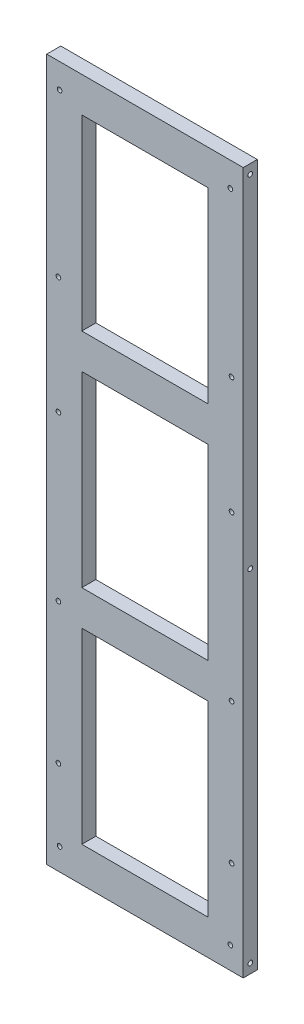
ISO-10303-21;
HEADER;
FILE_DESCRIPTION(('STEP AP214'),'2;1');
FILE_NAME('part.step','',(''),(''),'','','');
FILE_SCHEMA(('AUTOMOTIVE_DESIGN { 1 0 10303 214 1 1 1 1 }'));
ENDSEC;
DATA;
#1=APPLICATION_CONTEXT('core data for automotive mechanical design processes');
#2=APPLICATION_PROTOCOL_DEFINITION('international standard','automotive_design',2000,#1);
#3=PRODUCT_CONTEXT('',#1,'mechanical');
#4=PRODUCT('Part','Part','',(#3));
#5=PRODUCT_RELATED_PRODUCT_CATEGORY('part','',(#4));
#6=PRODUCT_DEFINITION_FORMATION('','',#4);
#7=PRODUCT_DEFINITION_CONTEXT('part definition',#1,'design');
#8=PRODUCT_DEFINITION('design','',#6,#7);
#9=PRODUCT_DEFINITION_SHAPE('','',#8);
#10=(LENGTH_UNIT() NAMED_UNIT(*) SI_UNIT(.MILLI.,.METRE.));
#11=(NAMED_UNIT(*) PLANE_ANGLE_UNIT() SI_UNIT($,.RADIAN.));
#12=(NAMED_UNIT(*) SI_UNIT($,.STERADIAN.) SOLID_ANGLE_UNIT());
#13=UNCERTAINTY_MEASURE_WITH_UNIT(LENGTH_MEASURE(1.E-05),#10,'distance_accuracy_value','');
#14=(GEOMETRIC_REPRESENTATION_CONTEXT(3) GLOBAL_UNCERTAINTY_ASSIGNED_CONTEXT((#13)) GLOBAL_UNIT_ASSIGNED_CONTEXT((#10,
#11,#12)) REPRESENTATION_CONTEXT('',''));
#15=CARTESIAN_POINT('',(0.,0.,0.));
#16=DIRECTION('',(0.,0.,1.));
#17=DIRECTION('',(1.,0.,0.));
#18=AXIS2_PLACEMENT_3D('',#15,#16,#17);
#19=CARTESIAN_POINT('',(0.,0.,6.));
#20=DIRECTION('',(0.,0.,-1.));
#21=DIRECTION('',(-1.,0.,0.));
#22=AXIS2_PLACEMENT_3D('',#19,#20,#21);
#23=PLANE('',#22);
#24=CARTESIAN_POINT('',(36.5,-140.5,6.));
#25=DIRECTION('',(0.,0.,1.));
#26=DIRECTION('',(1.,0.,0.));
#27=AXIS2_PLACEMENT_3D('',#24,#25,#26);
#28=CIRCLE('',#27,0.999999999999998);
#29=CARTESIAN_POINT('',(37.5,-140.5,6.));
#30=VERTEX_POINT('',#29);
#31=EDGE_CURVE('E563',#30,#30,#28,.T.);
#32=ORIENTED_EDGE('',*,*,#31,.F.);
#33=EDGE_LOOP('',(#32));
#34=FACE_BOUND('',#33,.T.);
#35=CARTESIAN_POINT('',(-36.5,139.5,6.));
#36=DIRECTION('',(0.,0.,1.));
#37=DIRECTION('',(1.,0.,0.));
#38=AXIS2_PLACEMENT_3D('',#35,#36,#37);
#39=CIRCLE('',#38,0.999999999999998);
#40=CARTESIAN_POINT('',(-35.5,139.5,6.));
#41=VERTEX_POINT('',#40);
#42=EDGE_CURVE('E560',#41,#41,#39,.T.);
#43=ORIENTED_EDGE('',*,*,#42,.F.);
#44=EDGE_LOOP('',(#43));
#45=FACE_BOUND('',#44,.T.);
#46=CARTESIAN_POINT('',(36.5,139.5,6.));
#47=DIRECTION('',(0.,0.,1.));
#48=DIRECTION('',(1.,0.,0.));
#49=AXIS2_PLACEMENT_3D('',#46,#47,#48);
#50=CIRCLE('',#49,0.999999999999998);
#51=CARTESIAN_POINT('',(37.5,139.5,6.));
#52=VERTEX_POINT('',#51);
#53=EDGE_CURVE('E558',#52,#52,#50,.T.);
#54=ORIENTED_EDGE('',*,*,#53,.F.);
#55=EDGE_LOOP('',(#54));
#56=FACE_BOUND('',#55,.T.);
#57=CARTESIAN_POINT('',(-36.5,-140.5,6.));
#58=DIRECTION('',(0.,0.,1.));
#59=DIRECTION('',(1.,0.,0.));
#60=AXIS2_PLACEMENT_3D('',#57,#58,#59);
#61=CIRCLE('',#60,0.999999999999998);
#62=CARTESIAN_POINT('',(-35.5,-140.5,6.));
#63=VERTEX_POINT('',#62);
#64=EDGE_CURVE('E303',#63,#63,#61,.T.);
#65=ORIENTED_EDGE('',*,*,#64,.F.);
#66=EDGE_LOOP('',(#65));
#67=FACE_BOUND('',#66,.T.);
#68=CARTESIAN_POINT('',(37.,-110.,6.));
#69=DIRECTION('',(0.,0.,1.));
#70=DIRECTION('',(-1.,0.,0.));
#71=AXIS2_PLACEMENT_3D('',#68,#69,#70);
#72=CIRCLE('',#71,0.999999999999998);
#73=CARTESIAN_POINT('',(36.,-110.,6.));
#74=VERTEX_POINT('',#73);
#75=EDGE_CURVE('E323',#74,#74,#72,.T.);
#76=ORIENTED_EDGE('',*,*,#75,.F.);
#77=EDGE_LOOP('',(#76));
#78=FACE_BOUND('',#77,.T.);
#79=CARTESIAN_POINT('',(37.,-50.,6.));
#80=DIRECTION('',(0.,0.,1.));
#81=DIRECTION('',(-1.,0.,0.));
#82=AXIS2_PLACEMENT_3D('',#79,#80,#81);
#83=CIRCLE('',#82,0.999999999999998);
#84=CARTESIAN_POINT('',(36.,-50.,6.));
#85=VERTEX_POINT('',#84);
#86=EDGE_CURVE('E326',#85,#85,#83,.T.);
#87=ORIENTED_EDGE('',*,*,#86,.F.);
#88=EDGE_LOOP('',(#87));
#89=FACE_BOUND('',#88,.T.);
#90=CARTESIAN_POINT('',(-37.,20.,6.));
#91=DIRECTION('',(0.,0.,1.));
#92=DIRECTION('',(1.,0.,0.));
#93=AXIS2_PLACEMENT_3D('',#90,#91,#92);
#94=CIRCLE('',#93,0.999999999999998);
#95=CARTESIAN_POINT('',(-36.,20.,6.));
#96=VERTEX_POINT('',#95);
#97=EDGE_CURVE('E329',#96,#96,#94,.T.);
#98=ORIENTED_EDGE('',*,*,#97,.F.);
#99=EDGE_LOOP('',(#98));
#100=FACE_BOUND('',#99,.T.);
#101=CARTESIAN_POINT('',(37.,20.,6.));
#102=DIRECTION('',(0.,0.,1.));
#103=DIRECTION('',(-1.,0.,0.));
#104=AXIS2_PLACEMENT_3D('',#101,#102,#103);
#105=CIRCLE('',#104,0.999999999999998);
#106=CARTESIAN_POINT('',(36.,20.,6.));
#107=VERTEX_POINT('',#106);
#108=EDGE_CURVE('E332',#107,#107,#105,.T.);
#109=ORIENTED_EDGE('',*,*,#108,.F.);
#110=EDGE_LOOP('',(#109));
#111=FACE_BOUND('',#110,.T.);
#112=CARTESIAN_POINT('',(37.,70.,6.));
#113=DIRECTION('',(0.,0.,1.));
#114=DIRECTION('',(-1.,0.,0.));
#115=AXIS2_PLACEMENT_3D('',#112,#113,#114);
#116=CIRCLE('',#115,0.999999999999998);
#117=CARTESIAN_POINT('',(36.,70.,6.));
#118=VERTEX_POINT('',#117);
#119=EDGE_CURVE('E319',#118,#118,#116,.T.);
#120=ORIENTED_EDGE('',*,*,#119,.F.);
#121=EDGE_LOOP('',(#120));
#122=FACE_BOUND('',#121,.T.);
#123=CARTESIAN_POINT('',(-37.,70.,6.));
#124=DIRECTION('',(0.,0.,1.));
#125=DIRECTION('',(1.,0.,0.));
#126=AXIS2_PLACEMENT_3D('',#123,#124,#125);
#127=CIRCLE('',#126,0.999999999999998);
#128=CARTESIAN_POINT('',(-36.,70.,6.));
#129=VERTEX_POINT('',#128);
#130=EDGE_CURVE('E314',#129,#129,#127,.T.);
#131=ORIENTED_EDGE('',*,*,#130,.F.);
#132=EDGE_LOOP('',(#131));
#133=FACE_BOUND('',#132,.T.);
#134=CARTESIAN_POINT('',(-37.,-50.,6.));
#135=DIRECTION('',(0.,0.,1.));
#136=DIRECTION('',(1.,0.,0.));
#137=AXIS2_PLACEMENT_3D('',#134,#135,#136);
#138=CIRCLE('',#137,0.999999999999998);
#139=CARTESIAN_POINT('',(-36.,-50.,6.));
#140=VERTEX_POINT('',#139);
#141=EDGE_CURVE('E310',#140,#140,#138,.T.);
#142=ORIENTED_EDGE('',*,*,#141,.F.);
#143=EDGE_LOOP('',(#142));
#144=FACE_BOUND('',#143,.T.);
#145=CARTESIAN_POINT('',(-37.,-110.,6.));
#146=DIRECTION('',(0.,0.,1.));
#147=DIRECTION('',(1.,0.,0.));
#148=AXIS2_PLACEMENT_3D('',#145,#146,#147);
#149=CIRCLE('',#148,0.999999999999998);
#150=CARTESIAN_POINT('',(-36.,-110.,6.));
#151=VERTEX_POINT('',#150);
#152=EDGE_CURVE('E277',#151,#151,#149,.T.);
#153=ORIENTED_EDGE('',*,*,#152,.F.);
#154=EDGE_LOOP('',(#153));
#155=FACE_BOUND('',#154,.T.);
#156=DIRECTION('',(0.,-1.,0.));
#157=VECTOR('',#156,1.);
#158=CARTESIAN_POINT('',(-27.,-135.,6.));
#159=LINE('',#158,#157);
#160=CARTESIAN_POINT('',(-27.,-55.,6.));
#161=VERTEX_POINT('',#160);
#162=CARTESIAN_POINT('',(-27.,-135.,6.));
#163=VERTEX_POINT('',#162);
#164=EDGE_CURVE('E186',#161,#163,#159,.T.);
#165=ORIENTED_EDGE('',*,*,#164,.F.);
#166=DIRECTION('',(-1.,0.,0.));
#167=VECTOR('',#166,1.);
#168=CARTESIAN_POINT('',(-27.,-55.,6.));
#169=LINE('',#168,#167);
#170=CARTESIAN_POINT('',(27.,-55.,6.));
#171=VERTEX_POINT('',#170);
#172=EDGE_CURVE('E194',#171,#161,#169,.T.);
#173=ORIENTED_EDGE('',*,*,#172,.F.);
#174=DIRECTION('',(0.,1.,0.));
#175=VECTOR('',#174,1.);
#176=CARTESIAN_POINT('',(27.,-55.,6.));
#177=LINE('',#176,#175);
#178=CARTESIAN_POINT('',(27.,-135.,6.));
#179=VERTEX_POINT('',#178);
#180=EDGE_CURVE('E191',#179,#171,#177,.T.);
#181=ORIENTED_EDGE('',*,*,#180,.F.);
#182=DIRECTION('',(1.,0.,0.));
#183=VECTOR('',#182,1.);
#184=CARTESIAN_POINT('',(-27.,-135.,6.));
#185=LINE('',#184,#183);
#186=EDGE_CURVE('E188',#163,#179,#185,.T.);
#187=ORIENTED_EDGE('',*,*,#186,.F.);
#188=EDGE_LOOP('',(#165,#173,#181,#187));
#189=FACE_BOUND('',#188,.T.);
#190=DIRECTION('',(0.,1.,0.));
#191=VECTOR('',#190,1.);
#192=CARTESIAN_POINT('',(42.,-150.,6.));
#193=LINE('',#192,#191);
#194=CARTESIAN_POINT('',(42.,-150.,6.));
#195=VERTEX_POINT('',#194);
#196=CARTESIAN_POINT('',(42.,150.,6.));
#197=VERTEX_POINT('',#196);
#198=EDGE_CURVE('E248',#195,#197,#193,.T.);
#199=ORIENTED_EDGE('',*,*,#198,.T.);
#200=DIRECTION('',(-1.,0.,0.));
#201=VECTOR('',#200,1.);
#202=CARTESIAN_POINT('',(-42.,150.,6.));
#203=LINE('',#202,#201);
#204=CARTESIAN_POINT('',(-42.,150.,6.));
#205=VERTEX_POINT('',#204);
#206=EDGE_CURVE('E251',#197,#205,#203,.T.);
#207=ORIENTED_EDGE('',*,*,#206,.T.);
#208=DIRECTION('',(0.,-1.,0.));
#209=VECTOR('',#208,1.);
#210=CARTESIAN_POINT('',(-42.,-150.,6.));
#211=LINE('',#210,#209);
#212=CARTESIAN_POINT('',(-42.,-150.,6.));
#213=VERTEX_POINT('',#212);
#214=EDGE_CURVE('E254',#205,#213,#211,.T.);
#215=ORIENTED_EDGE('',*,*,#214,.T.);
#216=DIRECTION('',(1.,0.,0.));
#217=VECTOR('',#216,1.);
#218=CARTESIAN_POINT('',(-42.,-150.,6.));
#219=LINE('',#218,#217);
#220=EDGE_CURVE('E256',#213,#195,#219,.T.);
#221=ORIENTED_EDGE('',*,*,#220,.T.);
#222=EDGE_LOOP('',(#199,#207,#215,#221));
#223=FACE_BOUND('',#222,.T.);
#224=DIRECTION('',(-1.,0.,0.));
#225=VECTOR('',#224,1.);
#226=CARTESIAN_POINT('',(-27.,135.,6.));
#227=LINE('',#226,#225);
#228=CARTESIAN_POINT('',(27.,135.,6.));
#229=VERTEX_POINT('',#228);
#230=CARTESIAN_POINT('',(-27.,135.,6.));
#231=VERTEX_POINT('',#230);
#232=EDGE_CURVE('E217',#229,#231,#227,.T.);
#233=ORIENTED_EDGE('',*,*,#232,.F.);
#234=DIRECTION('',(0.,1.,0.));
#235=VECTOR('',#234,1.);
#236=CARTESIAN_POINT('',(27.,135.,6.));
#237=LINE('',#236,#235);
#238=CARTESIAN_POINT('',(27.,55.,6.));
#239=VERTEX_POINT('',#238);
#240=EDGE_CURVE('E225',#239,#229,#237,.T.);
#241=ORIENTED_EDGE('',*,*,#240,.F.);
#242=DIRECTION('',(1.,0.,0.));
#243=VECTOR('',#242,1.);
#244=CARTESIAN_POINT('',(-27.,55.,6.));
#245=LINE('',#244,#243);
#246=CARTESIAN_POINT('',(-27.,55.,6.));
#247=VERTEX_POINT('',#246);
#248=EDGE_CURVE('E222',#247,#239,#245,.T.);
#249=ORIENTED_EDGE('',*,*,#248,.F.);
#250=DIRECTION('',(0.,-1.,0.));
#251=VECTOR('',#250,1.);
#252=CARTESIAN_POINT('',(-27.,55.,6.));
#253=LINE('',#252,#251);
#254=EDGE_CURVE('E219',#231,#247,#253,.T.);
#255=ORIENTED_EDGE('',*,*,#254,.F.);
#256=EDGE_LOOP('',(#233,#241,#249,#255));
#257=FACE_BOUND('',#256,.T.);
#258=DIRECTION('',(0.,1.,0.));
#259=VECTOR('',#258,1.);
#260=CARTESIAN_POINT('',(27.,40.,6.));
#261=LINE('',#260,#259);
#262=CARTESIAN_POINT('',(27.,-40.,6.));
#263=VERTEX_POINT('',#262);
#264=CARTESIAN_POINT('',(27.,40.,6.));
#265=VERTEX_POINT('',#264);
#266=EDGE_CURVE('E148',#263,#265,#261,.T.);
#267=ORIENTED_EDGE('',*,*,#266,.F.);
#268=DIRECTION('',(1.,0.,0.));
#269=VECTOR('',#268,1.);
#270=CARTESIAN_POINT('',(-27.,-40.,6.));
#271=LINE('',#270,#269);
#272=CARTESIAN_POINT('',(-27.,-40.,6.));
#273=VERTEX_POINT('',#272);
#274=EDGE_CURVE('E170',#273,#263,#271,.T.);
#275=ORIENTED_EDGE('',*,*,#274,.F.);
#276=DIRECTION('',(0.,-1.,0.));
#277=VECTOR('',#276,1.);
#278=CARTESIAN_POINT('',(-27.,-40.,6.));
#279=LINE('',#278,#277);
#280=CARTESIAN_POINT('',(-27.,40.,6.));
#281=VERTEX_POINT('',#280);
#282=EDGE_CURVE('E168',#281,#273,#279,.T.);
#283=ORIENTED_EDGE('',*,*,#282,.F.);
#284=DIRECTION('',(-1.,0.,0.));
#285=VECTOR('',#284,1.);
#286=CARTESIAN_POINT('',(-27.,40.,6.));
#287=LINE('',#286,#285);
#288=EDGE_CURVE('E156',#265,#281,#287,.T.);
#289=ORIENTED_EDGE('',*,*,#288,.F.);
#290=EDGE_LOOP('',(#267,#275,#283,#289));
#291=FACE_BOUND('',#290,.T.);
#292=ADVANCED_FACE('F33',(#34,#45,#56,#67,#78,#89,#100,#111,#122,#133,#144,#155,#189,#223,#257,
#291),#23,.F.);
#293=CARTESIAN_POINT('',(0.,0.,0.));
#294=DIRECTION('',(0.,0.,-1.));
#295=DIRECTION('',(-1.,0.,0.));
#296=AXIS2_PLACEMENT_3D('',#293,#294,#295);
#297=PLANE('',#296);
#298=CARTESIAN_POINT('',(36.5,-140.5,0.));
#299=DIRECTION('',(0.,0.,-1.));
#300=DIRECTION('',(-1.,0.,0.));
#301=AXIS2_PLACEMENT_3D('',#298,#299,#300);
#302=CIRCLE('',#301,0.999999999999998);
#303=CARTESIAN_POINT('',(35.5,-140.5,0.));
#304=VERTEX_POINT('',#303);
#305=EDGE_CURVE('E37',#304,#304,#302,.T.);
#306=ORIENTED_EDGE('',*,*,#305,.F.);
#307=EDGE_LOOP('',(#306));
#308=FACE_BOUND('',#307,.T.);
#309=CARTESIAN_POINT('',(-36.5,139.5,0.));
#310=DIRECTION('',(0.,0.,-1.));
#311=DIRECTION('',(-1.,0.,0.));
#312=AXIS2_PLACEMENT_3D('',#309,#310,#311);
#313=CIRCLE('',#312,0.999999999999998);
#314=CARTESIAN_POINT('',(-37.5,139.5,0.));
#315=VERTEX_POINT('',#314);
#316=EDGE_CURVE('E305',#315,#315,#313,.T.);
#317=ORIENTED_EDGE('',*,*,#316,.F.);
#318=EDGE_LOOP('',(#317));
#319=FACE_BOUND('',#318,.T.);
#320=CARTESIAN_POINT('',(36.5,139.5,0.));
#321=DIRECTION('',(0.,0.,-1.));
#322=DIRECTION('',(-1.,0.,0.));
#323=AXIS2_PLACEMENT_3D('',#320,#321,#322);
#324=CIRCLE('',#323,0.999999999999998);
#325=CARTESIAN_POINT('',(35.5,139.5,0.));
#326=VERTEX_POINT('',#325);
#327=EDGE_CURVE('E302',#326,#326,#324,.T.);
#328=ORIENTED_EDGE('',*,*,#327,.F.);
#329=EDGE_LOOP('',(#328));
#330=FACE_BOUND('',#329,.T.);
#331=CARTESIAN_POINT('',(-36.5,-140.5,0.));
#332=DIRECTION('',(0.,0.,-1.));
#333=DIRECTION('',(-1.,0.,0.));
#334=AXIS2_PLACEMENT_3D('',#331,#332,#333);
#335=CIRCLE('',#334,0.999999999999998);
#336=CARTESIAN_POINT('',(-37.5,-140.5,0.));
#337=VERTEX_POINT('',#336);
#338=EDGE_CURVE('E299',#337,#337,#335,.T.);
#339=ORIENTED_EDGE('',*,*,#338,.F.);
#340=EDGE_LOOP('',(#339));
#341=FACE_BOUND('',#340,.T.);
#342=CARTESIAN_POINT('',(37.,-110.,0.));
#343=DIRECTION('',(0.,0.,-1.));
#344=DIRECTION('',(-1.,0.,0.));
#345=AXIS2_PLACEMENT_3D('',#342,#343,#344);
#346=CIRCLE('',#345,0.999999999999998);
#347=CARTESIAN_POINT('',(36.,-110.,0.));
#348=VERTEX_POINT('',#347);
#349=EDGE_CURVE('E295',#348,#348,#346,.T.);
#350=ORIENTED_EDGE('',*,*,#349,.F.);
#351=EDGE_LOOP('',(#350));
#352=FACE_BOUND('',#351,.T.);
#353=CARTESIAN_POINT('',(37.,-50.,0.));
#354=DIRECTION('',(0.,0.,-1.));
#355=DIRECTION('',(-1.,0.,0.));
#356=AXIS2_PLACEMENT_3D('',#353,#354,#355);
#357=CIRCLE('',#356,0.999999999999998);
#358=CARTESIAN_POINT('',(36.,-50.,0.));
#359=VERTEX_POINT('',#358);
#360=EDGE_CURVE('E292',#359,#359,#357,.T.);
#361=ORIENTED_EDGE('',*,*,#360,.F.);
#362=EDGE_LOOP('',(#361));
#363=FACE_BOUND('',#362,.T.);
#364=CARTESIAN_POINT('',(-37.,20.,0.));
#365=DIRECTION('',(0.,0.,-1.));
#366=DIRECTION('',(-1.,0.,0.));
#367=AXIS2_PLACEMENT_3D('',#364,#365,#366);
#368=CIRCLE('',#367,0.999999999999998);
#369=CARTESIAN_POINT('',(-38.,20.,0.));
#370=VERTEX_POINT('',#369);
#371=EDGE_CURVE('E289',#370,#370,#368,.T.);
#372=ORIENTED_EDGE('',*,*,#371,.F.);
#373=EDGE_LOOP('',(#372));
#374=FACE_BOUND('',#373,.T.);
#375=CARTESIAN_POINT('',(37.,20.,0.));
#376=DIRECTION('',(0.,0.,-1.));
#377=DIRECTION('',(-1.,0.,0.));
#378=AXIS2_PLACEMENT_3D('',#375,#376,#377);
#379=CIRCLE('',#378,0.999999999999998);
#380=CARTESIAN_POINT('',(36.,20.,0.));
#381=VERTEX_POINT('',#380);
#382=EDGE_CURVE('E286',#381,#381,#379,.T.);
#383=ORIENTED_EDGE('',*,*,#382,.F.);
#384=EDGE_LOOP('',(#383));
#385=FACE_BOUND('',#384,.T.);
#386=CARTESIAN_POINT('',(37.,70.,0.));
#387=DIRECTION('',(0.,0.,-1.));
#388=DIRECTION('',(-1.,0.,0.));
#389=AXIS2_PLACEMENT_3D('',#386,#387,#388);
#390=CIRCLE('',#389,0.999999999999998);
#391=CARTESIAN_POINT('',(36.,70.,0.));
#392=VERTEX_POINT('',#391);
#393=EDGE_CURVE('E283',#392,#392,#390,.T.);
#394=ORIENTED_EDGE('',*,*,#393,.F.);
#395=EDGE_LOOP('',(#394));
#396=FACE_BOUND('',#395,.T.);
#397=CARTESIAN_POINT('',(-37.,70.,0.));
#398=DIRECTION('',(0.,0.,-1.));
#399=DIRECTION('',(-1.,0.,0.));
#400=AXIS2_PLACEMENT_3D('',#397,#398,#399);
#401=CIRCLE('',#400,0.999999999999998);
#402=CARTESIAN_POINT('',(-38.,70.,0.));
#403=VERTEX_POINT('',#402);
#404=EDGE_CURVE('E280',#403,#403,#401,.T.);
#405=ORIENTED_EDGE('',*,*,#404,.F.);
#406=EDGE_LOOP('',(#405));
#407=FACE_BOUND('',#406,.T.);
#408=CARTESIAN_POINT('',(-37.,-50.,0.));
#409=DIRECTION('',(0.,0.,-1.));
#410=DIRECTION('',(-1.,0.,0.));
#411=AXIS2_PLACEMENT_3D('',#408,#409,#410);
#412=CIRCLE('',#411,0.999999999999998);
#413=CARTESIAN_POINT('',(-38.,-50.,0.));
#414=VERTEX_POINT('',#413);
#415=EDGE_CURVE('E276',#414,#414,#412,.T.);
#416=ORIENTED_EDGE('',*,*,#415,.F.);
#417=EDGE_LOOP('',(#416));
#418=FACE_BOUND('',#417,.T.);
#419=CARTESIAN_POINT('',(-37.,-110.,0.));
#420=DIRECTION('',(0.,0.,-1.));
#421=DIRECTION('',(-1.,0.,0.));
#422=AXIS2_PLACEMENT_3D('',#419,#420,#421);
#423=CIRCLE('',#422,0.999999999999998);
#424=CARTESIAN_POINT('',(-38.,-110.,0.));
#425=VERTEX_POINT('',#424);
#426=EDGE_CURVE('E273',#425,#425,#423,.T.);
#427=ORIENTED_EDGE('',*,*,#426,.F.);
#428=EDGE_LOOP('',(#427));
#429=FACE_BOUND('',#428,.T.);
#430=DIRECTION('',(0.,1.,0.));
#431=VECTOR('',#430,1.);
#432=CARTESIAN_POINT('',(42.,-150.,0.));
#433=LINE('',#432,#431);
#434=CARTESIAN_POINT('',(42.,-150.,0.));
#435=VERTEX_POINT('',#434);
#436=CARTESIAN_POINT('',(42.,150.,0.));
#437=VERTEX_POINT('',#436);
#438=EDGE_CURVE('E247',#435,#437,#433,.T.);
#439=ORIENTED_EDGE('',*,*,#438,.F.);
#440=DIRECTION('',(1.,0.,0.));
#441=VECTOR('',#440,1.);
#442=CARTESIAN_POINT('',(-42.,-150.,0.));
#443=LINE('',#442,#441);
#444=CARTESIAN_POINT('',(-42.,-150.,0.));
#445=VERTEX_POINT('',#444);
#446=EDGE_CURVE('E252',#445,#435,#443,.T.);
#447=ORIENTED_EDGE('',*,*,#446,.F.);
#448=DIRECTION('',(0.,-1.,0.));
#449=VECTOR('',#448,1.);
#450=CARTESIAN_POINT('',(-42.,-150.,0.));
#451=LINE('',#450,#449);
#452=CARTESIAN_POINT('',(-42.,150.,0.));
#453=VERTEX_POINT('',#452);
#454=EDGE_CURVE('E263',#453,#445,#451,.T.);
#455=ORIENTED_EDGE('',*,*,#454,.F.);
#456=DIRECTION('',(-1.,0.,0.));
#457=VECTOR('',#456,1.);
#458=CARTESIAN_POINT('',(-42.,150.,0.));
#459=LINE('',#458,#457);
#460=EDGE_CURVE('E261',#437,#453,#459,.T.);
#461=ORIENTED_EDGE('',*,*,#460,.F.);
#462=EDGE_LOOP('',(#439,#447,#455,#461));
#463=FACE_BOUND('',#462,.T.);
#464=DIRECTION('',(0.,1.,0.));
#465=VECTOR('',#464,1.);
#466=CARTESIAN_POINT('',(27.,135.,0.));
#467=LINE('',#466,#465);
#468=CARTESIAN_POINT('',(27.,55.,0.));
#469=VERTEX_POINT('',#468);
#470=CARTESIAN_POINT('',(27.,135.,0.));
#471=VERTEX_POINT('',#470);
#472=EDGE_CURVE('E220',#469,#471,#467,.T.);
#473=ORIENTED_EDGE('',*,*,#472,.T.);
#474=DIRECTION('',(-1.,0.,0.));
#475=VECTOR('',#474,1.);
#476=CARTESIAN_POINT('',(-27.,135.,0.));
#477=LINE('',#476,#475);
#478=CARTESIAN_POINT('',(-27.,135.,0.));
#479=VERTEX_POINT('',#478);
#480=EDGE_CURVE('E216',#471,#479,#477,.T.);
#481=ORIENTED_EDGE('',*,*,#480,.T.);
#482=DIRECTION('',(0.,-1.,0.));
#483=VECTOR('',#482,1.);
#484=CARTESIAN_POINT('',(-27.,55.,0.));
#485=LINE('',#484,#483);
#486=CARTESIAN_POINT('',(-27.,55.,0.));
#487=VERTEX_POINT('',#486);
#488=EDGE_CURVE('E230',#479,#487,#485,.T.);
#489=ORIENTED_EDGE('',*,*,#488,.T.);
#490=DIRECTION('',(1.,0.,0.));
#491=VECTOR('',#490,1.);
#492=CARTESIAN_POINT('',(-27.,55.,0.));
#493=LINE('',#492,#491);
#494=EDGE_CURVE('E233',#487,#469,#493,.T.);
#495=ORIENTED_EDGE('',*,*,#494,.T.);
#496=EDGE_LOOP('',(#473,#481,#489,#495));
#497=FACE_BOUND('',#496,.T.);
#498=DIRECTION('',(-1.,0.,0.));
#499=VECTOR('',#498,1.);
#500=CARTESIAN_POINT('',(-27.,-55.,0.));
#501=LINE('',#500,#499);
#502=CARTESIAN_POINT('',(27.,-55.,0.));
#503=VERTEX_POINT('',#502);
#504=CARTESIAN_POINT('',(-27.,-55.,0.));
#505=VERTEX_POINT('',#504);
#506=EDGE_CURVE('E189',#503,#505,#501,.T.);
#507=ORIENTED_EDGE('',*,*,#506,.T.);
#508=DIRECTION('',(0.,-1.,0.));
#509=VECTOR('',#508,1.);
#510=CARTESIAN_POINT('',(-27.,-135.,0.));
#511=LINE('',#510,#509);
#512=CARTESIAN_POINT('',(-27.,-135.,0.));
#513=VERTEX_POINT('',#512);
#514=EDGE_CURVE('E164',#505,#513,#511,.T.);
#515=ORIENTED_EDGE('',*,*,#514,.T.);
#516=DIRECTION('',(1.,0.,0.));
#517=VECTOR('',#516,1.);
#518=CARTESIAN_POINT('',(-27.,-135.,0.));
#519=LINE('',#518,#517);
#520=CARTESIAN_POINT('',(27.,-135.,0.));
#521=VERTEX_POINT('',#520);
#522=EDGE_CURVE('E199',#513,#521,#519,.T.);
#523=ORIENTED_EDGE('',*,*,#522,.T.);
#524=DIRECTION('',(0.,1.,0.));
#525=VECTOR('',#524,1.);
#526=CARTESIAN_POINT('',(27.,-55.,0.));
#527=LINE('',#526,#525);
#528=EDGE_CURVE('E202',#521,#503,#527,.T.);
#529=ORIENTED_EDGE('',*,*,#528,.T.);
#530=EDGE_LOOP('',(#507,#515,#523,#529));
#531=FACE_BOUND('',#530,.T.);
#532=DIRECTION('',(1.,0.,0.));
#533=VECTOR('',#532,1.);
#534=CARTESIAN_POINT('',(-27.,-40.,0.));
#535=LINE('',#534,#533);
#536=CARTESIAN_POINT('',(-27.,-40.,0.));
#537=VERTEX_POINT('',#536);
#538=CARTESIAN_POINT('',(27.,-40.,0.));
#539=VERTEX_POINT('',#538);
#540=EDGE_CURVE('E157',#537,#539,#535,.T.);
#541=ORIENTED_EDGE('',*,*,#540,.T.);
#542=DIRECTION('',(0.,1.,0.));
#543=VECTOR('',#542,1.);
#544=CARTESIAN_POINT('',(27.,40.,0.));
#545=LINE('',#544,#543);
#546=CARTESIAN_POINT('',(27.,40.,0.));
#547=VERTEX_POINT('',#546);
#548=EDGE_CURVE('E58',#539,#547,#545,.T.);
#549=ORIENTED_EDGE('',*,*,#548,.T.);
#550=DIRECTION('',(-1.,0.,0.));
#551=VECTOR('',#550,1.);
#552=CARTESIAN_POINT('',(-27.,40.,0.));
#553=LINE('',#552,#551);
#554=CARTESIAN_POINT('',(-27.,40.,0.));
#555=VERTEX_POINT('',#554);
#556=EDGE_CURVE('E163',#547,#555,#553,.T.);
#557=ORIENTED_EDGE('',*,*,#556,.T.);
#558=DIRECTION('',(0.,-1.,0.));
#559=VECTOR('',#558,1.);
#560=CARTESIAN_POINT('',(-27.,-40.,0.));
#561=LINE('',#560,#559);
#562=EDGE_CURVE('E178',#555,#537,#561,.T.);
#563=ORIENTED_EDGE('',*,*,#562,.T.);
#564=EDGE_LOOP('',(#541,#549,#557,#563));
#565=FACE_BOUND('',#564,.T.);
#566=ADVANCED_FACE('F376',(#308,#319,#330,#341,#352,#363,#374,#385,#396,#407,#418,#429,#463,
#497,#531,#565),#297,.T.);
#567=CARTESIAN_POINT('',(42.,-150.,6.));
#568=DIRECTION('',(-1.,0.,0.));
#569=DIRECTION('',(0.,0.,1.));
#570=AXIS2_PLACEMENT_3D('',#567,#568,#569);
#571=PLANE('',#570);
#572=CARTESIAN_POINT('',(42.,146.,3.));
#573=DIRECTION('',(1.,0.,0.));
#574=DIRECTION('',(0.,0.,-1.));
#575=AXIS2_PLACEMENT_3D('',#572,#573,#574);
#576=CIRCLE('',#575,1.);
#577=CARTESIAN_POINT('',(42.,146.,2.));
#578=VERTEX_POINT('',#577);
#579=EDGE_CURVE('E357',#578,#578,#576,.T.);
#580=ORIENTED_EDGE('',*,*,#579,.F.);
#581=EDGE_LOOP('',(#580));
#582=FACE_BOUND('',#581,.T.);
#583=CARTESIAN_POINT('',(42.,0.,3.));
#584=DIRECTION('',(1.,0.,0.));
#585=DIRECTION('',(0.,0.,-1.));
#586=AXIS2_PLACEMENT_3D('',#583,#584,#585);
#587=CIRCLE('',#586,1.);
#588=CARTESIAN_POINT('',(42.,0.,2.));
#589=VERTEX_POINT('',#588);
#590=EDGE_CURVE('E363',#589,#589,#587,.T.);
#591=ORIENTED_EDGE('',*,*,#590,.F.);
#592=EDGE_LOOP('',(#591));
#593=FACE_BOUND('',#592,.T.);
#594=CARTESIAN_POINT('',(42.,-146.,3.));
#595=DIRECTION('',(1.,0.,0.));
#596=DIRECTION('',(0.,0.,-1.));
#597=AXIS2_PLACEMENT_3D('',#594,#595,#596);
#598=CIRCLE('',#597,1.);
#599=CARTESIAN_POINT('',(42.,-146.,2.));
#600=VERTEX_POINT('',#599);
#601=EDGE_CURVE('E340',#600,#600,#598,.T.);
#602=ORIENTED_EDGE('',*,*,#601,.F.);
#603=EDGE_LOOP('',(#602));
#604=FACE_BOUND('',#603,.T.);
#605=ORIENTED_EDGE('',*,*,#438,.T.);
#606=DIRECTION('',(0.,0.,-1.));
#607=VECTOR('',#606,1.);
#608=CARTESIAN_POINT('',(42.,150.,6.));
#609=LINE('',#608,#607);
#610=EDGE_CURVE('E11',#197,#437,#609,.T.);
#611=ORIENTED_EDGE('',*,*,#610,.F.);
#612=ORIENTED_EDGE('',*,*,#198,.F.);
#613=DIRECTION('',(0.,0.,-1.));
#614=VECTOR('',#613,1.);
#615=CARTESIAN_POINT('',(42.,-150.,6.));
#616=LINE('',#615,#614);
#617=EDGE_CURVE('E258',#195,#435,#616,.T.);
#618=ORIENTED_EDGE('',*,*,#617,.T.);
#619=EDGE_LOOP('',(#605,#611,#612,#618));
#620=FACE_BOUND('',#619,.T.);
#621=ADVANCED_FACE('F35',(#582,#593,#604,#620),#571,.F.);
#622=CARTESIAN_POINT('',(-42.,150.,6.));
#623=DIRECTION('',(0.,-1.,0.));
#624=DIRECTION('',(0.,0.,-1.));
#625=AXIS2_PLACEMENT_3D('',#622,#623,#624);
#626=PLANE('',#625);
#627=ORIENTED_EDGE('',*,*,#460,.T.);
#628=DIRECTION('',(0.,0.,-1.));
#629=VECTOR('',#628,1.);
#630=CARTESIAN_POINT('',(-42.,150.,6.));
#631=LINE('',#630,#629);
#632=EDGE_CURVE('E42',#205,#453,#631,.T.);
#633=ORIENTED_EDGE('',*,*,#632,.F.);
#634=ORIENTED_EDGE('',*,*,#206,.F.);
#635=ORIENTED_EDGE('',*,*,#610,.T.);
#636=EDGE_LOOP('',(#627,#633,#634,#635));
#637=FACE_BOUND('',#636,.T.);
#638=ADVANCED_FACE('F375',(#637),#626,.F.);
#639=CARTESIAN_POINT('',(-42.,-150.,6.));
#640=DIRECTION('',(1.,0.,0.));
#641=DIRECTION('',(0.,0.,-1.));
#642=AXIS2_PLACEMENT_3D('',#639,#640,#641);
#643=PLANE('',#642);
#644=CARTESIAN_POINT('',(-42.,146.,3.));
#645=DIRECTION('',(1.,0.,0.));
#646=DIRECTION('',(0.,0.,-1.));
#647=AXIS2_PLACEMENT_3D('',#644,#645,#646);
#648=CIRCLE('',#647,1.);
#649=CARTESIAN_POINT('',(-42.,146.,2.));
#650=VERTEX_POINT('',#649);
#651=EDGE_CURVE('E341',#650,#650,#648,.T.);
#652=ORIENTED_EDGE('',*,*,#651,.T.);
#653=EDGE_LOOP('',(#652));
#654=FACE_BOUND('',#653,.T.);
#655=CARTESIAN_POINT('',(-42.,0.,3.));
#656=DIRECTION('',(1.,0.,0.));
#657=DIRECTION('',(0.,0.,-1.));
#658=AXIS2_PLACEMENT_3D('',#655,#656,#657);
#659=CIRCLE('',#658,1.);
#660=CARTESIAN_POINT('',(-42.,0.,2.));
#661=VERTEX_POINT('',#660);
#662=EDGE_CURVE('E347',#661,#661,#659,.T.);
#663=ORIENTED_EDGE('',*,*,#662,.T.);
#664=EDGE_LOOP('',(#663));
#665=FACE_BOUND('',#664,.T.);
#666=CARTESIAN_POINT('',(-42.,-146.,3.));
#667=DIRECTION('',(1.,0.,0.));
#668=DIRECTION('',(0.,0.,-1.));
#669=AXIS2_PLACEMENT_3D('',#666,#667,#668);
#670=CIRCLE('',#669,1.);
#671=CARTESIAN_POINT('',(-42.,-146.,2.));
#672=VERTEX_POINT('',#671);
#673=EDGE_CURVE('E298',#672,#672,#670,.T.);
#674=ORIENTED_EDGE('',*,*,#673,.T.);
#675=EDGE_LOOP('',(#674));
#676=FACE_BOUND('',#675,.T.);
#677=ORIENTED_EDGE('',*,*,#454,.T.);
#678=DIRECTION('',(0.,0.,-1.));
#679=VECTOR('',#678,1.);
#680=CARTESIAN_POINT('',(-42.,-150.,6.));
#681=LINE('',#680,#679);
#682=EDGE_CURVE('E268',#213,#445,#681,.T.);
#683=ORIENTED_EDGE('',*,*,#682,.F.);
#684=ORIENTED_EDGE('',*,*,#214,.F.);
#685=ORIENTED_EDGE('',*,*,#632,.T.);
#686=EDGE_LOOP('',(#677,#683,#684,#685));
#687=FACE_BOUND('',#686,.T.);
#688=ADVANCED_FACE('F396',(#654,#665,#676,#687),#643,.F.);
#689=CARTESIAN_POINT('',(-42.,-150.,6.));
#690=DIRECTION('',(0.,1.,0.));
#691=DIRECTION('',(0.,0.,1.));
#692=AXIS2_PLACEMENT_3D('',#689,#690,#691);
#693=PLANE('',#692);
#694=ORIENTED_EDGE('',*,*,#446,.T.);
#695=ORIENTED_EDGE('',*,*,#617,.F.);
#696=ORIENTED_EDGE('',*,*,#220,.F.);
#697=ORIENTED_EDGE('',*,*,#682,.T.);
#698=EDGE_LOOP('',(#694,#695,#696,#697));
#699=FACE_BOUND('',#698,.T.);
#700=ADVANCED_FACE('F394',(#699),#693,.F.);
#701=CARTESIAN_POINT('',(-27.,135.,6.));
#702=DIRECTION('',(0.,-1.,0.));
#703=DIRECTION('',(0.,0.,-1.));
#704=AXIS2_PLACEMENT_3D('',#701,#702,#703);
#705=PLANE('',#704);
#706=ORIENTED_EDGE('',*,*,#480,.F.);
#707=DIRECTION('',(0.,0.,-1.));
#708=VECTOR('',#707,1.);
#709=CARTESIAN_POINT('',(27.,135.,6.));
#710=LINE('',#709,#708);
#711=EDGE_CURVE('E227',#229,#471,#710,.T.);
#712=ORIENTED_EDGE('',*,*,#711,.F.);
#713=ORIENTED_EDGE('',*,*,#232,.T.);
#714=DIRECTION('',(0.,0.,-1.));
#715=VECTOR('',#714,1.);
#716=CARTESIAN_POINT('',(-27.,135.,6.));
#717=LINE('',#716,#715);
#718=EDGE_CURVE('E244',#231,#479,#717,.T.);
#719=ORIENTED_EDGE('',*,*,#718,.T.);
#720=EDGE_LOOP('',(#706,#712,#713,#719));
#721=FACE_BOUND('',#720,.T.);
#722=ADVANCED_FACE('F404',(#721),#705,.T.);
#723=CARTESIAN_POINT('',(-27.,55.,6.));
#724=DIRECTION('',(1.,0.,0.));
#725=DIRECTION('',(0.,0.,-1.));
#726=AXIS2_PLACEMENT_3D('',#723,#724,#725);
#727=PLANE('',#726);
#728=ORIENTED_EDGE('',*,*,#488,.F.);
#729=ORIENTED_EDGE('',*,*,#718,.F.);
#730=ORIENTED_EDGE('',*,*,#254,.T.);
#731=DIRECTION('',(0.,0.,-1.));
#732=VECTOR('',#731,1.);
#733=CARTESIAN_POINT('',(-27.,55.,6.));
#734=LINE('',#733,#732);
#735=EDGE_CURVE('E242',#247,#487,#734,.T.);
#736=ORIENTED_EDGE('',*,*,#735,.T.);
#737=EDGE_LOOP('',(#728,#729,#730,#736));
#738=FACE_BOUND('',#737,.T.);
#739=ADVANCED_FACE('F420',(#738),#727,.T.);
#740=CARTESIAN_POINT('',(-27.,55.,6.));
#741=DIRECTION('',(0.,1.,0.));
#742=DIRECTION('',(0.,0.,1.));
#743=AXIS2_PLACEMENT_3D('',#740,#741,#742);
#744=PLANE('',#743);
#745=ORIENTED_EDGE('',*,*,#494,.F.);
#746=ORIENTED_EDGE('',*,*,#735,.F.);
#747=ORIENTED_EDGE('',*,*,#248,.T.);
#748=DIRECTION('',(0.,0.,-1.));
#749=VECTOR('',#748,1.);
#750=CARTESIAN_POINT('',(27.,55.,6.));
#751=LINE('',#750,#749);
#752=EDGE_CURVE('E240',#239,#469,#751,.T.);
#753=ORIENTED_EDGE('',*,*,#752,.T.);
#754=EDGE_LOOP('',(#745,#746,#747,#753));
#755=FACE_BOUND('',#754,.T.);
#756=ADVANCED_FACE('F424',(#755),#744,.T.);
#757=CARTESIAN_POINT('',(27.,135.,6.));
#758=DIRECTION('',(-1.,0.,0.));
#759=DIRECTION('',(0.,0.,1.));
#760=AXIS2_PLACEMENT_3D('',#757,#758,#759);
#761=PLANE('',#760);
#762=ORIENTED_EDGE('',*,*,#472,.F.);
#763=ORIENTED_EDGE('',*,*,#752,.F.);
#764=ORIENTED_EDGE('',*,*,#240,.T.);
#765=ORIENTED_EDGE('',*,*,#711,.T.);
#766=EDGE_LOOP('',(#762,#763,#764,#765));
#767=FACE_BOUND('',#766,.T.);
#768=ADVANCED_FACE('F428',(#767),#761,.T.);
#769=CARTESIAN_POINT('',(-27.,-135.,6.));
#770=DIRECTION('',(1.,0.,0.));
#771=DIRECTION('',(0.,1.,0.));
#772=AXIS2_PLACEMENT_3D('',#769,#770,#771);
#773=PLANE('',#772);
#774=ORIENTED_EDGE('',*,*,#514,.F.);
#775=DIRECTION('',(0.,0.,-1.));
#776=VECTOR('',#775,1.);
#777=CARTESIAN_POINT('',(-27.,-55.,6.));
#778=LINE('',#777,#776);
#779=EDGE_CURVE('E196',#161,#505,#778,.T.);
#780=ORIENTED_EDGE('',*,*,#779,.F.);
#781=ORIENTED_EDGE('',*,*,#164,.T.);
#782=DIRECTION('',(0.,0.,-1.));
#783=VECTOR('',#782,1.);
#784=CARTESIAN_POINT('',(-27.,-135.,6.));
#785=LINE('',#784,#783);
#786=EDGE_CURVE('E213',#163,#513,#785,.T.);
#787=ORIENTED_EDGE('',*,*,#786,.T.);
#788=EDGE_LOOP('',(#774,#780,#781,#787));
#789=FACE_BOUND('',#788,.T.);
#790=ADVANCED_FACE('F432',(#789),#773,.T.);
#791=CARTESIAN_POINT('',(-27.,-135.,6.));
#792=DIRECTION('',(0.,1.,0.));
#793=DIRECTION('',(0.,0.,1.));
#794=AXIS2_PLACEMENT_3D('',#791,#792,#793);
#795=PLANE('',#794);
#796=ORIENTED_EDGE('',*,*,#522,.F.);
#797=ORIENTED_EDGE('',*,*,#786,.F.);
#798=ORIENTED_EDGE('',*,*,#186,.T.);
#799=DIRECTION('',(0.,0.,-1.));
#800=VECTOR('',#799,1.);
#801=CARTESIAN_POINT('',(27.,-135.,6.));
#802=LINE('',#801,#800);
#803=EDGE_CURVE('E211',#179,#521,#802,.T.);
#804=ORIENTED_EDGE('',*,*,#803,.T.);
#805=EDGE_LOOP('',(#796,#797,#798,#804));
#806=FACE_BOUND('',#805,.T.);
#807=ADVANCED_FACE('F436',(#806),#795,.T.);
#808=CARTESIAN_POINT('',(27.,-55.,6.));
#809=DIRECTION('',(-1.,0.,0.));
#810=DIRECTION('',(0.,-1.,0.));
#811=AXIS2_PLACEMENT_3D('',#808,#809,#810);
#812=PLANE('',#811);
#813=ORIENTED_EDGE('',*,*,#528,.F.);
#814=ORIENTED_EDGE('',*,*,#803,.F.);
#815=ORIENTED_EDGE('',*,*,#180,.T.);
#816=DIRECTION('',(0.,0.,-1.));
#817=VECTOR('',#816,1.);
#818=CARTESIAN_POINT('',(27.,-55.,6.));
#819=LINE('',#818,#817);
#820=EDGE_CURVE('E209',#171,#503,#819,.T.);
#821=ORIENTED_EDGE('',*,*,#820,.T.);
#822=EDGE_LOOP('',(#813,#814,#815,#821));
#823=FACE_BOUND('',#822,.T.);
#824=ADVANCED_FACE('F440',(#823),#812,.T.);
#825=CARTESIAN_POINT('',(-27.,-55.,6.));
#826=DIRECTION('',(0.,-1.,0.));
#827=DIRECTION('',(0.,0.,-1.));
#828=AXIS2_PLACEMENT_3D('',#825,#826,#827);
#829=PLANE('',#828);
#830=ORIENTED_EDGE('',*,*,#506,.F.);
#831=ORIENTED_EDGE('',*,*,#820,.F.);
#832=ORIENTED_EDGE('',*,*,#172,.T.);
#833=ORIENTED_EDGE('',*,*,#779,.T.);
#834=EDGE_LOOP('',(#830,#831,#832,#833));
#835=FACE_BOUND('',#834,.T.);
#836=ADVANCED_FACE('F444',(#835),#829,.T.);
#837=CARTESIAN_POINT('',(27.,40.,6.));
#838=DIRECTION('',(-1.,0.,0.));
#839=DIRECTION('',(0.,0.,1.));
#840=AXIS2_PLACEMENT_3D('',#837,#838,#839);
#841=PLANE('',#840);
#842=ORIENTED_EDGE('',*,*,#548,.F.);
#843=DIRECTION('',(0.,0.,-1.));
#844=VECTOR('',#843,1.);
#845=CARTESIAN_POINT('',(27.,-40.,6.));
#846=LINE('',#845,#844);
#847=EDGE_CURVE('E152',#263,#539,#846,.T.);
#848=ORIENTED_EDGE('',*,*,#847,.F.);
#849=ORIENTED_EDGE('',*,*,#266,.T.);
#850=DIRECTION('',(0.,0.,-1.));
#851=VECTOR('',#850,1.);
#852=CARTESIAN_POINT('',(27.,40.,6.));
#853=LINE('',#852,#851);
#854=EDGE_CURVE('E151',#265,#547,#853,.T.);
#855=ORIENTED_EDGE('',*,*,#854,.T.);
#856=EDGE_LOOP('',(#842,#848,#849,#855));
#857=FACE_BOUND('',#856,.T.);
#858=ADVANCED_FACE('F150',(#857),#841,.T.);
#859=CARTESIAN_POINT('',(-27.,40.,6.));
#860=DIRECTION('',(0.,-1.,0.));
#861=DIRECTION('',(0.,0.,-1.));
#862=AXIS2_PLACEMENT_3D('',#859,#860,#861);
#863=PLANE('',#862);
#864=ORIENTED_EDGE('',*,*,#556,.F.);
#865=ORIENTED_EDGE('',*,*,#854,.F.);
#866=ORIENTED_EDGE('',*,*,#288,.T.);
#867=DIRECTION('',(0.,0.,-1.));
#868=VECTOR('',#867,1.);
#869=CARTESIAN_POINT('',(-27.,40.,6.));
#870=LINE('',#869,#868);
#871=EDGE_CURVE('E165',#281,#555,#870,.T.);
#872=ORIENTED_EDGE('',*,*,#871,.T.);
#873=EDGE_LOOP('',(#864,#865,#866,#872));
#874=FACE_BOUND('',#873,.T.);
#875=ADVANCED_FACE('F160',(#874),#863,.T.);
#876=CARTESIAN_POINT('',(-27.,-40.,6.));
#877=DIRECTION('',(1.,0.,0.));
#878=DIRECTION('',(0.,0.,-1.));
#879=AXIS2_PLACEMENT_3D('',#876,#877,#878);
#880=PLANE('',#879);
#881=ORIENTED_EDGE('',*,*,#562,.F.);
#882=ORIENTED_EDGE('',*,*,#871,.F.);
#883=ORIENTED_EDGE('',*,*,#282,.T.);
#884=DIRECTION('',(0.,0.,-1.));
#885=VECTOR('',#884,1.);
#886=CARTESIAN_POINT('',(-27.,-40.,6.));
#887=LINE('',#886,#885);
#888=EDGE_CURVE('E50',#273,#537,#887,.T.);
#889=ORIENTED_EDGE('',*,*,#888,.T.);
#890=EDGE_LOOP('',(#881,#882,#883,#889));
#891=FACE_BOUND('',#890,.T.);
#892=ADVANCED_FACE('F453',(#891),#880,.T.);
#893=CARTESIAN_POINT('',(-27.,-40.,6.));
#894=DIRECTION('',(0.,1.,0.));
#895=DIRECTION('',(0.,0.,1.));
#896=AXIS2_PLACEMENT_3D('',#893,#894,#895);
#897=PLANE('',#896);
#898=ORIENTED_EDGE('',*,*,#540,.F.);
#899=ORIENTED_EDGE('',*,*,#888,.F.);
#900=ORIENTED_EDGE('',*,*,#274,.T.);
#901=ORIENTED_EDGE('',*,*,#847,.T.);
#902=EDGE_LOOP('',(#898,#899,#900,#901));
#903=FACE_BOUND('',#902,.T.);
#904=ADVANCED_FACE('F456',(#903),#897,.T.);
#905=CARTESIAN_POINT('',(32.,-146.,3.));
#906=DIRECTION('',(1.,0.,0.));
#907=DIRECTION('',(0.,0.,-1.));
#908=AXIS2_PLACEMENT_3D('',#905,#906,#907);
#909=CYLINDRICAL_SURFACE('',#908,1.);
#910=CARTESIAN_POINT('',(32.,-146.,3.));
#911=DIRECTION('',(1.,0.,0.));
#912=DIRECTION('',(0.,0.,-1.));
#913=AXIS2_PLACEMENT_3D('',#910,#911,#912);
#914=CIRCLE('',#913,1.);
#915=CARTESIAN_POINT('',(32.,-146.,2.));
#916=VERTEX_POINT('',#915);
#917=EDGE_CURVE('E366',#916,#916,#914,.T.);
#918=ORIENTED_EDGE('',*,*,#917,.F.);
#919=EDGE_LOOP('',(#918));
#920=FACE_BOUND('',#919,.T.);
#921=ORIENTED_EDGE('',*,*,#601,.T.);
#922=EDGE_LOOP('',(#921));
#923=FACE_BOUND('',#922,.T.);
#924=ADVANCED_FACE('F371',(#920,#923),#909,.F.);
#925=CARTESIAN_POINT('',(32.,-146.,3.));
#926=DIRECTION('',(1.,0.,0.));
#927=DIRECTION('',(0.,0.,-1.));
#928=AXIS2_PLACEMENT_3D('',#925,#926,#927);
#929=PLANE('',#928);
#930=ORIENTED_EDGE('',*,*,#917,.T.);
#931=EDGE_LOOP('',(#930));
#932=FACE_BOUND('',#931,.T.);
#933=ADVANCED_FACE('F462',(#932),#929,.T.);
#934=CARTESIAN_POINT('',(32.,0.,3.));
#935=DIRECTION('',(1.,0.,0.));
#936=DIRECTION('',(0.,0.,-1.));
#937=AXIS2_PLACEMENT_3D('',#934,#935,#936);
#938=CYLINDRICAL_SURFACE('',#937,1.);
#939=CARTESIAN_POINT('',(32.,0.,3.));
#940=DIRECTION('',(1.,0.,0.));
#941=DIRECTION('',(0.,0.,-1.));
#942=AXIS2_PLACEMENT_3D('',#939,#940,#941);
#943=CIRCLE('',#942,1.);
#944=CARTESIAN_POINT('',(32.,0.,2.));
#945=VERTEX_POINT('',#944);
#946=EDGE_CURVE('E360',#945,#945,#943,.T.);
#947=ORIENTED_EDGE('',*,*,#946,.F.);
#948=EDGE_LOOP('',(#947));
#949=FACE_BOUND('',#948,.T.);
#950=ORIENTED_EDGE('',*,*,#590,.T.);
#951=EDGE_LOOP('',(#950));
#952=FACE_BOUND('',#951,.T.);
#953=ADVANCED_FACE('F466',(#949,#952),#938,.F.);
#954=CARTESIAN_POINT('',(32.,0.,3.));
#955=DIRECTION('',(1.,0.,0.));
#956=DIRECTION('',(0.,0.,-1.));
#957=AXIS2_PLACEMENT_3D('',#954,#955,#956);
#958=PLANE('',#957);
#959=ORIENTED_EDGE('',*,*,#946,.T.);
#960=EDGE_LOOP('',(#959));
#961=FACE_BOUND('',#960,.T.);
#962=ADVANCED_FACE('F470',(#961),#958,.T.);
#963=CARTESIAN_POINT('',(32.,146.,3.));
#964=DIRECTION('',(1.,0.,0.));
#965=DIRECTION('',(0.,0.,-1.));
#966=AXIS2_PLACEMENT_3D('',#963,#964,#965);
#967=CYLINDRICAL_SURFACE('',#966,1.);
#968=CARTESIAN_POINT('',(32.,146.,3.));
#969=DIRECTION('',(1.,0.,0.));
#970=DIRECTION('',(0.,0.,-1.));
#971=AXIS2_PLACEMENT_3D('',#968,#969,#970);
#972=CIRCLE('',#971,1.);
#973=CARTESIAN_POINT('',(32.,146.,2.));
#974=VERTEX_POINT('',#973);
#975=EDGE_CURVE('E176',#974,#974,#972,.T.);
#976=ORIENTED_EDGE('',*,*,#975,.F.);
#977=EDGE_LOOP('',(#976));
#978=FACE_BOUND('',#977,.T.);
#979=ORIENTED_EDGE('',*,*,#579,.T.);
#980=EDGE_LOOP('',(#979));
#981=FACE_BOUND('',#980,.T.);
#982=ADVANCED_FACE('F474',(#978,#981),#967,.F.);
#983=CARTESIAN_POINT('',(32.,146.,3.));
#984=DIRECTION('',(1.,0.,0.));
#985=DIRECTION('',(0.,0.,-1.));
#986=AXIS2_PLACEMENT_3D('',#983,#984,#985);
#987=PLANE('',#986);
#988=ORIENTED_EDGE('',*,*,#975,.T.);
#989=EDGE_LOOP('',(#988));
#990=FACE_BOUND('',#989,.T.);
#991=ADVANCED_FACE('F478',(#990),#987,.T.);
#992=CARTESIAN_POINT('',(-32.,-146.,3.));
#993=DIRECTION('',(-1.,0.,0.));
#994=DIRECTION('',(0.,0.,1.));
#995=AXIS2_PLACEMENT_3D('',#992,#993,#994);
#996=CYLINDRICAL_SURFACE('',#995,1.);
#997=CARTESIAN_POINT('',(-32.,-146.,3.));
#998=DIRECTION('',(1.,0.,0.));
#999=DIRECTION('',(0.,0.,-1.));
#1000=AXIS2_PLACEMENT_3D('',#997,#998,#999);
#1001=CIRCLE('',#1000,1.);
#1002=CARTESIAN_POINT('',(-32.,-146.,2.));
#1003=VERTEX_POINT('',#1002);
#1004=EDGE_CURVE('E350',#1003,#1003,#1001,.T.);
#1005=ORIENTED_EDGE('',*,*,#1004,.T.);
#1006=EDGE_LOOP('',(#1005));
#1007=FACE_BOUND('',#1006,.T.);
#1008=ORIENTED_EDGE('',*,*,#673,.F.);
#1009=EDGE_LOOP('',(#1008));
#1010=FACE_BOUND('',#1009,.T.);
#1011=ADVANCED_FACE('F482',(#1007,#1010),#996,.F.);
#1012=CARTESIAN_POINT('',(-32.,-146.,3.));
#1013=DIRECTION('',(-1.,0.,0.));
#1014=DIRECTION('',(0.,0.,-1.));
#1015=AXIS2_PLACEMENT_3D('',#1012,#1013,#1014);
#1016=PLANE('',#1015);
#1017=ORIENTED_EDGE('',*,*,#1004,.F.);
#1018=EDGE_LOOP('',(#1017));
#1019=FACE_BOUND('',#1018,.T.);
#1020=ADVANCED_FACE('F486',(#1019),#1016,.T.);
#1021=CARTESIAN_POINT('',(-32.,0.,3.));
#1022=DIRECTION('',(-1.,0.,0.));
#1023=DIRECTION('',(0.,0.,1.));
#1024=AXIS2_PLACEMENT_3D('',#1021,#1022,#1023);
#1025=CYLINDRICAL_SURFACE('',#1024,1.);
#1026=CARTESIAN_POINT('',(-32.,0.,3.));
#1027=DIRECTION('',(1.,0.,0.));
#1028=DIRECTION('',(0.,0.,-1.));
#1029=AXIS2_PLACEMENT_3D('',#1026,#1027,#1028);
#1030=CIRCLE('',#1029,1.);
#1031=CARTESIAN_POINT('',(-32.,0.,2.));
#1032=VERTEX_POINT('',#1031);
#1033=EDGE_CURVE('E344',#1032,#1032,#1030,.T.);
#1034=ORIENTED_EDGE('',*,*,#1033,.T.);
#1035=EDGE_LOOP('',(#1034));
#1036=FACE_BOUND('',#1035,.T.);
#1037=ORIENTED_EDGE('',*,*,#662,.F.);
#1038=EDGE_LOOP('',(#1037));
#1039=FACE_BOUND('',#1038,.T.);
#1040=ADVANCED_FACE('F490',(#1036,#1039),#1025,.F.);
#1041=CARTESIAN_POINT('',(-32.,0.,3.));
#1042=DIRECTION('',(-1.,0.,0.));
#1043=DIRECTION('',(0.,0.,-1.));
#1044=AXIS2_PLACEMENT_3D('',#1041,#1042,#1043);
#1045=PLANE('',#1044);
#1046=ORIENTED_EDGE('',*,*,#1033,.F.);
#1047=EDGE_LOOP('',(#1046));
#1048=FACE_BOUND('',#1047,.T.);
#1049=ADVANCED_FACE('F494',(#1048),#1045,.T.);
#1050=CARTESIAN_POINT('',(-32.,146.,3.));
#1051=DIRECTION('',(-1.,0.,0.));
#1052=DIRECTION('',(0.,0.,1.));
#1053=AXIS2_PLACEMENT_3D('',#1050,#1051,#1052);
#1054=CYLINDRICAL_SURFACE('',#1053,1.);
#1055=CARTESIAN_POINT('',(-32.,146.,3.));
#1056=DIRECTION('',(1.,0.,0.));
#1057=DIRECTION('',(0.,0.,-1.));
#1058=AXIS2_PLACEMENT_3D('',#1055,#1056,#1057);
#1059=CIRCLE('',#1058,1.);
#1060=CARTESIAN_POINT('',(-32.,146.,2.));
#1061=VERTEX_POINT('',#1060);
#1062=EDGE_CURVE('E337',#1061,#1061,#1059,.T.);
#1063=ORIENTED_EDGE('',*,*,#1062,.T.);
#1064=EDGE_LOOP('',(#1063));
#1065=FACE_BOUND('',#1064,.T.);
#1066=ORIENTED_EDGE('',*,*,#651,.F.);
#1067=EDGE_LOOP('',(#1066));
#1068=FACE_BOUND('',#1067,.T.);
#1069=ADVANCED_FACE('F498',(#1065,#1068),#1054,.F.);
#1070=CARTESIAN_POINT('',(-32.,146.,3.));
#1071=DIRECTION('',(-1.,0.,0.));
#1072=DIRECTION('',(0.,0.,-1.));
#1073=AXIS2_PLACEMENT_3D('',#1070,#1071,#1072);
#1074=PLANE('',#1073);
#1075=ORIENTED_EDGE('',*,*,#1062,.F.);
#1076=EDGE_LOOP('',(#1075));
#1077=FACE_BOUND('',#1076,.T.);
#1078=ADVANCED_FACE('F502',(#1077),#1074,.T.);
#1079=CARTESIAN_POINT('',(-37.,-110.,-4.));
#1080=DIRECTION('',(0.,0.,1.));
#1081=DIRECTION('',(1.,0.,0.));
#1082=AXIS2_PLACEMENT_3D('',#1079,#1080,#1081);
#1083=CYLINDRICAL_SURFACE('',#1082,0.999999999999998);
#1084=ORIENTED_EDGE('',*,*,#426,.T.);
#1085=EDGE_LOOP('',(#1084));
#1086=FACE_BOUND('',#1085,.T.);
#1087=ORIENTED_EDGE('',*,*,#152,.T.);
#1088=EDGE_LOOP('',(#1087));
#1089=FACE_BOUND('',#1088,.T.);
#1090=ADVANCED_FACE('F506',(#1086,#1089),#1083,.F.);
#1091=CARTESIAN_POINT('',(-37.,-50.,-4.));
#1092=DIRECTION('',(0.,0.,1.));
#1093=DIRECTION('',(1.,0.,0.));
#1094=AXIS2_PLACEMENT_3D('',#1091,#1092,#1093);
#1095=CYLINDRICAL_SURFACE('',#1094,0.999999999999998);
#1096=ORIENTED_EDGE('',*,*,#415,.T.);
#1097=EDGE_LOOP('',(#1096));
#1098=FACE_BOUND('',#1097,.T.);
#1099=ORIENTED_EDGE('',*,*,#141,.T.);
#1100=EDGE_LOOP('',(#1099));
#1101=FACE_BOUND('',#1100,.T.);
#1102=ADVANCED_FACE('F510',(#1098,#1101),#1095,.F.);
#1103=CARTESIAN_POINT('',(-37.,70.,-4.));
#1104=DIRECTION('',(0.,0.,1.));
#1105=DIRECTION('',(1.,0.,0.));
#1106=AXIS2_PLACEMENT_3D('',#1103,#1104,#1105);
#1107=CYLINDRICAL_SURFACE('',#1106,0.999999999999998);
#1108=ORIENTED_EDGE('',*,*,#404,.T.);
#1109=EDGE_LOOP('',(#1108));
#1110=FACE_BOUND('',#1109,.T.);
#1111=ORIENTED_EDGE('',*,*,#130,.T.);
#1112=EDGE_LOOP('',(#1111));
#1113=FACE_BOUND('',#1112,.T.);
#1114=ADVANCED_FACE('F532',(#1110,#1113),#1107,.F.);
#1115=CARTESIAN_POINT('',(37.,70.,-4.));
#1116=DIRECTION('',(0.,0.,1.));
#1117=DIRECTION('',(1.,0.,0.));
#1118=AXIS2_PLACEMENT_3D('',#1115,#1116,#1117);
#1119=CYLINDRICAL_SURFACE('',#1118,0.999999999999998);
#1120=ORIENTED_EDGE('',*,*,#393,.T.);
#1121=EDGE_LOOP('',(#1120));
#1122=FACE_BOUND('',#1121,.T.);
#1123=ORIENTED_EDGE('',*,*,#119,.T.);
#1124=EDGE_LOOP('',(#1123));
#1125=FACE_BOUND('',#1124,.T.);
#1126=ADVANCED_FACE('F516',(#1122,#1125),#1119,.F.);
#1127=CARTESIAN_POINT('',(37.,20.,-4.));
#1128=DIRECTION('',(0.,0.,1.));
#1129=DIRECTION('',(1.,0.,0.));
#1130=AXIS2_PLACEMENT_3D('',#1127,#1128,#1129);
#1131=CYLINDRICAL_SURFACE('',#1130,0.999999999999998);
#1132=ORIENTED_EDGE('',*,*,#382,.T.);
#1133=EDGE_LOOP('',(#1132));
#1134=FACE_BOUND('',#1133,.T.);
#1135=ORIENTED_EDGE('',*,*,#108,.T.);
#1136=EDGE_LOOP('',(#1135));
#1137=FACE_BOUND('',#1136,.T.);
#1138=ADVANCED_FACE('F512',(#1134,#1137),#1131,.F.);
#1139=CARTESIAN_POINT('',(-37.,20.,-4.));
#1140=DIRECTION('',(0.,0.,1.));
#1141=DIRECTION('',(1.,0.,0.));
#1142=AXIS2_PLACEMENT_3D('',#1139,#1140,#1141);
#1143=CYLINDRICAL_SURFACE('',#1142,0.999999999999998);
#1144=ORIENTED_EDGE('',*,*,#371,.T.);
#1145=EDGE_LOOP('',(#1144));
#1146=FACE_BOUND('',#1145,.T.);
#1147=ORIENTED_EDGE('',*,*,#97,.T.);
#1148=EDGE_LOOP('',(#1147));
#1149=FACE_BOUND('',#1148,.T.);
#1150=ADVANCED_FACE('F515',(#1146,#1149),#1143,.F.);
#1151=CARTESIAN_POINT('',(37.,-50.,-4.));
#1152=DIRECTION('',(0.,0.,1.));
#1153=DIRECTION('',(1.,0.,0.));
#1154=AXIS2_PLACEMENT_3D('',#1151,#1152,#1153);
#1155=CYLINDRICAL_SURFACE('',#1154,0.999999999999998);
#1156=ORIENTED_EDGE('',*,*,#360,.T.);
#1157=EDGE_LOOP('',(#1156));
#1158=FACE_BOUND('',#1157,.T.);
#1159=ORIENTED_EDGE('',*,*,#86,.T.);
#1160=EDGE_LOOP('',(#1159));
#1161=FACE_BOUND('',#1160,.T.);
#1162=ADVANCED_FACE('F520',(#1158,#1161),#1155,.F.);
#1163=CARTESIAN_POINT('',(37.,-110.,-4.));
#1164=DIRECTION('',(0.,0.,1.));
#1165=DIRECTION('',(1.,0.,0.));
#1166=AXIS2_PLACEMENT_3D('',#1163,#1164,#1165);
#1167=CYLINDRICAL_SURFACE('',#1166,0.999999999999998);
#1168=ORIENTED_EDGE('',*,*,#349,.T.);
#1169=EDGE_LOOP('',(#1168));
#1170=FACE_BOUND('',#1169,.T.);
#1171=ORIENTED_EDGE('',*,*,#75,.T.);
#1172=EDGE_LOOP('',(#1171));
#1173=FACE_BOUND('',#1172,.T.);
#1174=ADVANCED_FACE('F524',(#1170,#1173),#1167,.F.);
#1175=CARTESIAN_POINT('',(-36.5,-140.5,-4.));
#1176=DIRECTION('',(0.,0.,1.));
#1177=DIRECTION('',(1.,0.,0.));
#1178=AXIS2_PLACEMENT_3D('',#1175,#1176,#1177);
#1179=CYLINDRICAL_SURFACE('',#1178,0.999999999999998);
#1180=ORIENTED_EDGE('',*,*,#338,.T.);
#1181=EDGE_LOOP('',(#1180));
#1182=FACE_BOUND('',#1181,.T.);
#1183=ORIENTED_EDGE('',*,*,#64,.T.);
#1184=EDGE_LOOP('',(#1183));
#1185=FACE_BOUND('',#1184,.T.);
#1186=ADVANCED_FACE('F528',(#1182,#1185),#1179,.F.);
#1187=CARTESIAN_POINT('',(36.5,139.5,-4.));
#1188=DIRECTION('',(0.,0.,1.));
#1189=DIRECTION('',(1.,0.,0.));
#1190=AXIS2_PLACEMENT_3D('',#1187,#1188,#1189);
#1191=CYLINDRICAL_SURFACE('',#1190,0.999999999999998);
#1192=ORIENTED_EDGE('',*,*,#327,.T.);
#1193=EDGE_LOOP('',(#1192));
#1194=FACE_BOUND('',#1193,.T.);
#1195=ORIENTED_EDGE('',*,*,#53,.T.);
#1196=EDGE_LOOP('',(#1195));
#1197=FACE_BOUND('',#1196,.T.);
#1198=ADVANCED_FACE('F542',(#1194,#1197),#1191,.F.);
#1199=CARTESIAN_POINT('',(-36.5,139.5,-4.));
#1200=DIRECTION('',(0.,0.,1.));
#1201=DIRECTION('',(1.,0.,0.));
#1202=AXIS2_PLACEMENT_3D('',#1199,#1200,#1201);
#1203=CYLINDRICAL_SURFACE('',#1202,0.999999999999998);
#1204=ORIENTED_EDGE('',*,*,#316,.T.);
#1205=EDGE_LOOP('',(#1204));
#1206=FACE_BOUND('',#1205,.T.);
#1207=ORIENTED_EDGE('',*,*,#42,.T.);
#1208=EDGE_LOOP('',(#1207));
#1209=FACE_BOUND('',#1208,.T.);
#1210=ADVANCED_FACE('F544',(#1206,#1209),#1203,.F.);
#1211=CARTESIAN_POINT('',(36.5,-140.5,-4.));
#1212=DIRECTION('',(0.,0.,1.));
#1213=DIRECTION('',(1.,0.,0.));
#1214=AXIS2_PLACEMENT_3D('',#1211,#1212,#1213);
#1215=CYLINDRICAL_SURFACE('',#1214,0.999999999999998);
#1216=ORIENTED_EDGE('',*,*,#305,.T.);
#1217=EDGE_LOOP('',(#1216));
#1218=FACE_BOUND('',#1217,.T.);
#1219=ORIENTED_EDGE('',*,*,#31,.T.);
#1220=EDGE_LOOP('',(#1219));
#1221=FACE_BOUND('',#1220,.T.);
#1222=ADVANCED_FACE('F547',(#1218,#1221),#1215,.F.);
#1223=CLOSED_SHELL('',(#292,#566,#621,#638,#688,#700,#722,#739,#756,#768,#790,#807,#824,#836,
#858,#875,#892,#904,#924,#933,#953,#962,#982,#991,#1011,#1020,#1040,#1049,#1069,#1078,#1090,
#1102,#1114,#1126,#1138,#1150,#1162,#1174,#1186,#1198,#1210,#1222));
#1224=MANIFOLD_SOLID_BREP('B2',#1223);
#1225=ADVANCED_BREP_SHAPE_REPRESENTATION('',(#18,#1224),#14);
#1226=SHAPE_DEFINITION_REPRESENTATION(#9,#1225);
ENDSEC;
END-ISO-10303-21;
